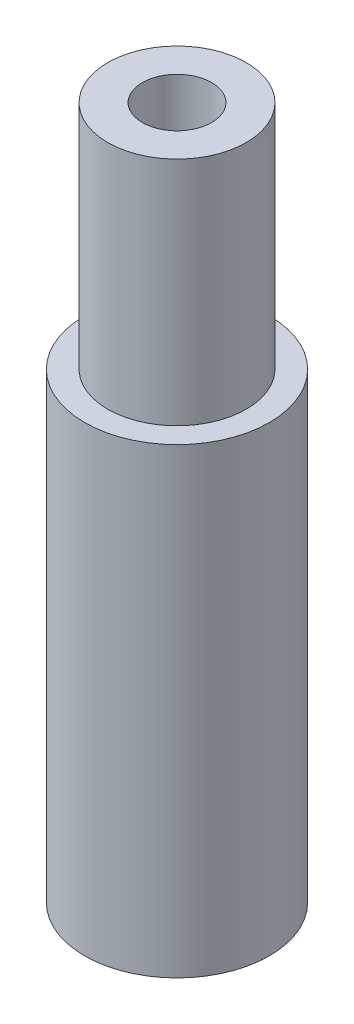
ISO-10303-21;
HEADER;
FILE_DESCRIPTION(('STEP AP214'),'2;1');
FILE_NAME('part.step','',(''),(''),'','','');
FILE_SCHEMA(('AUTOMOTIVE_DESIGN { 1 0 10303 214 1 1 1 1 }'));
ENDSEC;
DATA;
#1=APPLICATION_CONTEXT('core data for automotive mechanical design processes');
#2=APPLICATION_PROTOCOL_DEFINITION('international standard','automotive_design',2000,#1);
#3=PRODUCT_CONTEXT('',#1,'mechanical');
#4=PRODUCT('Part','Part','',(#3));
#5=PRODUCT_RELATED_PRODUCT_CATEGORY('part','',(#4));
#6=PRODUCT_DEFINITION_FORMATION('','',#4);
#7=PRODUCT_DEFINITION_CONTEXT('part definition',#1,'design');
#8=PRODUCT_DEFINITION('design','',#6,#7);
#9=PRODUCT_DEFINITION_SHAPE('','',#8);
#10=(LENGTH_UNIT() NAMED_UNIT(*) SI_UNIT(.MILLI.,.METRE.));
#11=(NAMED_UNIT(*) PLANE_ANGLE_UNIT() SI_UNIT($,.RADIAN.));
#12=(NAMED_UNIT(*) SI_UNIT($,.STERADIAN.) SOLID_ANGLE_UNIT());
#13=UNCERTAINTY_MEASURE_WITH_UNIT(LENGTH_MEASURE(1.E-05),#10,'distance_accuracy_value','');
#14=(GEOMETRIC_REPRESENTATION_CONTEXT(3) GLOBAL_UNCERTAINTY_ASSIGNED_CONTEXT((#13)) GLOBAL_UNIT_ASSIGNED_CONTEXT((#10,
#11,#12)) REPRESENTATION_CONTEXT('',''));
#15=CARTESIAN_POINT('',(0.,0.,0.));
#16=DIRECTION('',(0.,0.,1.));
#17=DIRECTION('',(1.,0.,0.));
#18=AXIS2_PLACEMENT_3D('',#15,#16,#17);
#19=CARTESIAN_POINT('',(0.,20.,0.));
#20=DIRECTION('',(0.,-1.,0.));
#21=DIRECTION('',(0.,0.,-1.));
#22=AXIS2_PLACEMENT_3D('',#19,#20,#21);
#23=CYLINDRICAL_SURFACE('',#22,4.);
#24=CARTESIAN_POINT('',(0.,20.,0.));
#25=DIRECTION('',(0.,1.,0.));
#26=DIRECTION('',(0.,0.,1.));
#27=AXIS2_PLACEMENT_3D('',#24,#25,#26);
#28=CIRCLE('',#27,4.);
#29=CARTESIAN_POINT('',(0.,20.,4.));
#30=VERTEX_POINT('',#29);
#31=EDGE_CURVE('E45',#30,#30,#28,.T.);
#32=ORIENTED_EDGE('',*,*,#31,.F.);
#33=EDGE_LOOP('',(#32));
#34=FACE_BOUND('',#33,.T.);
#35=CARTESIAN_POINT('',(0.,0.,0.));
#36=DIRECTION('',(0.,1.,0.));
#37=DIRECTION('',(0.,0.,1.));
#38=AXIS2_PLACEMENT_3D('',#35,#36,#37);
#39=CIRCLE('',#38,4.);
#40=CARTESIAN_POINT('',(0.,0.,4.));
#41=VERTEX_POINT('',#40);
#42=EDGE_CURVE('E40',#41,#41,#39,.T.);
#43=ORIENTED_EDGE('',*,*,#42,.T.);
#44=EDGE_LOOP('',(#43));
#45=FACE_BOUND('',#44,.T.);
#46=ADVANCED_FACE('F37',(#34,#45),#23,.T.);
#47=CARTESIAN_POINT('',(0.,20.,0.));
#48=DIRECTION('',(0.,1.,0.));
#49=DIRECTION('',(0.,0.,1.));
#50=AXIS2_PLACEMENT_3D('',#47,#48,#49);
#51=PLANE('',#50);
#52=CARTESIAN_POINT('',(0.,20.,0.));
#53=DIRECTION('',(0.,1.,0.));
#54=DIRECTION('',(0.,0.,1.));
#55=AXIS2_PLACEMENT_3D('',#52,#53,#54);
#56=CIRCLE('',#55,3.);
#57=CARTESIAN_POINT('',(0.,20.,3.));
#58=VERTEX_POINT('',#57);
#59=EDGE_CURVE('E10',#58,#58,#56,.T.);
#60=ORIENTED_EDGE('',*,*,#59,.F.);
#61=EDGE_LOOP('',(#60));
#62=FACE_BOUND('',#61,.T.);
#63=ORIENTED_EDGE('',*,*,#31,.T.);
#64=EDGE_LOOP('',(#63));
#65=FACE_BOUND('',#64,.T.);
#66=ADVANCED_FACE('F80',(#62,#65),#51,.T.);
#67=CARTESIAN_POINT('',(0.,0.,0.));
#68=DIRECTION('',(0.,1.,0.));
#69=DIRECTION('',(0.,0.,1.));
#70=AXIS2_PLACEMENT_3D('',#67,#68,#69);
#71=PLANE('',#70);
#72=ORIENTED_EDGE('',*,*,#42,.F.);
#73=EDGE_LOOP('',(#72));
#74=FACE_BOUND('',#73,.T.);
#75=ADVANCED_FACE('F75',(#74),#71,.F.);
#76=CARTESIAN_POINT('',(0.,30.,0.));
#77=DIRECTION('',(0.,-1.,0.));
#78=DIRECTION('',(0.,0.,-1.));
#79=AXIS2_PLACEMENT_3D('',#76,#77,#78);
#80=CYLINDRICAL_SURFACE('',#79,3.);
#81=CARTESIAN_POINT('',(0.,30.,0.));
#82=DIRECTION('',(0.,1.,0.));
#83=DIRECTION('',(0.,0.,1.));
#84=AXIS2_PLACEMENT_3D('',#81,#82,#83);
#85=CIRCLE('',#84,3.);
#86=CARTESIAN_POINT('',(0.,30.,3.));
#87=VERTEX_POINT('',#86);
#88=EDGE_CURVE('E52',#87,#87,#85,.T.);
#89=ORIENTED_EDGE('',*,*,#88,.F.);
#90=EDGE_LOOP('',(#89));
#91=FACE_BOUND('',#90,.T.);
#92=ORIENTED_EDGE('',*,*,#59,.T.);
#93=EDGE_LOOP('',(#92));
#94=FACE_BOUND('',#93,.T.);
#95=ADVANCED_FACE('F70',(#91,#94),#80,.T.);
#96=CARTESIAN_POINT('',(0.,30.,0.));
#97=DIRECTION('',(0.,1.,0.));
#98=DIRECTION('',(0.,0.,1.));
#99=AXIS2_PLACEMENT_3D('',#96,#97,#98);
#100=PLANE('',#99);
#101=CARTESIAN_POINT('',(0.,30.,0.));
#102=DIRECTION('',(0.,1.,0.));
#103=DIRECTION('',(0.,0.,1.));
#104=AXIS2_PLACEMENT_3D('',#101,#102,#103);
#105=CIRCLE('',#104,1.5);
#106=CARTESIAN_POINT('',(0.,30.,1.5));
#107=VERTEX_POINT('',#106);
#108=EDGE_CURVE('E60',#107,#107,#105,.T.);
#109=ORIENTED_EDGE('',*,*,#108,.F.);
#110=EDGE_LOOP('',(#109));
#111=FACE_BOUND('',#110,.T.);
#112=ORIENTED_EDGE('',*,*,#88,.T.);
#113=EDGE_LOOP('',(#112));
#114=FACE_BOUND('',#113,.T.);
#115=ADVANCED_FACE('F67',(#111,#114),#100,.T.);
#116=CARTESIAN_POINT('',(0.,15.7573593128807,0.));
#117=DIRECTION('',(0.,1.,0.));
#118=DIRECTION('',(0.,0.,1.));
#119=AXIS2_PLACEMENT_3D('',#116,#117,#118);
#120=CYLINDRICAL_SURFACE('',#119,1.5);
#121=CARTESIAN_POINT('',(0.,20.,0.));
#122=DIRECTION('',(0.,1.,0.));
#123=DIRECTION('',(0.,0.,1.));
#124=AXIS2_PLACEMENT_3D('',#121,#122,#123);
#125=CIRCLE('',#124,1.5);
#126=CARTESIAN_POINT('',(0.,20.,1.5));
#127=VERTEX_POINT('',#126);
#128=EDGE_CURVE('E56',#127,#127,#125,.F.);
#129=ORIENTED_EDGE('',*,*,#128,.T.);
#130=EDGE_LOOP('',(#129));
#131=FACE_BOUND('',#130,.T.);
#132=ORIENTED_EDGE('',*,*,#108,.T.);
#133=EDGE_LOOP('',(#132));
#134=FACE_BOUND('',#133,.T.);
#135=ADVANCED_FACE('F65',(#131,#134),#120,.F.);
#136=CARTESIAN_POINT('',(0.,20.,0.));
#137=DIRECTION('',(0.,1.,0.));
#138=DIRECTION('',(0.,0.,1.));
#139=AXIS2_PLACEMENT_3D('',#136,#137,#138);
#140=PLANE('',#139);
#141=ORIENTED_EDGE('',*,*,#128,.F.);
#142=EDGE_LOOP('',(#141));
#143=FACE_BOUND('',#142,.T.);
#144=ADVANCED_FACE('F126',(#143),#140,.T.);
#145=CLOSED_SHELL('',(#46,#66,#75,#95,#115,#135,#144));
#146=MANIFOLD_SOLID_BREP('B2',#145);
#147=ADVANCED_BREP_SHAPE_REPRESENTATION('',(#18,#146),#14);
#148=SHAPE_DEFINITION_REPRESENTATION(#9,#147);
ENDSEC;
END-ISO-10303-21;
